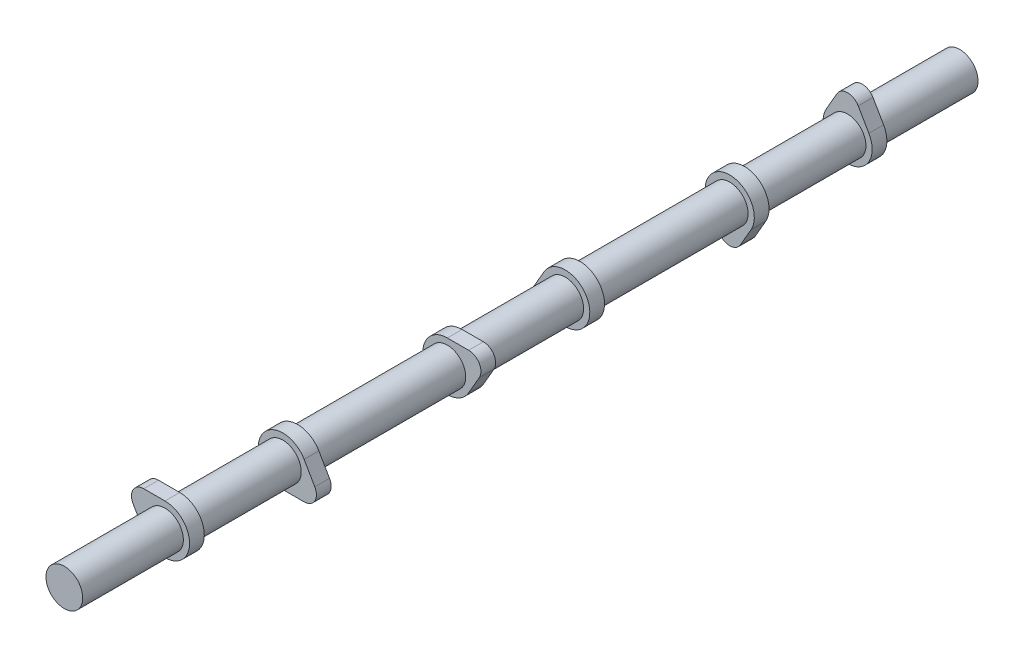
ISO-10303-21;
HEADER;
FILE_DESCRIPTION(('STEP AP214'),'2;1');
FILE_NAME('part.step','',(''),(''),'','','');
FILE_SCHEMA(('AUTOMOTIVE_DESIGN { 1 0 10303 214 1 1 1 1 }'));
ENDSEC;
DATA;
#1=APPLICATION_CONTEXT('core data for automotive mechanical design processes');
#2=APPLICATION_PROTOCOL_DEFINITION('international standard','automotive_design',2000,#1);
#3=PRODUCT_CONTEXT('',#1,'mechanical');
#4=PRODUCT('Part','Part','',(#3));
#5=PRODUCT_RELATED_PRODUCT_CATEGORY('part','',(#4));
#6=PRODUCT_DEFINITION_FORMATION('','',#4);
#7=PRODUCT_DEFINITION_CONTEXT('part definition',#1,'design');
#8=PRODUCT_DEFINITION('design','',#6,#7);
#9=PRODUCT_DEFINITION_SHAPE('','',#8);
#10=(LENGTH_UNIT() NAMED_UNIT(*) SI_UNIT(.MILLI.,.METRE.));
#11=(NAMED_UNIT(*) PLANE_ANGLE_UNIT() SI_UNIT($,.RADIAN.));
#12=(NAMED_UNIT(*) SI_UNIT($,.STERADIAN.) SOLID_ANGLE_UNIT());
#13=UNCERTAINTY_MEASURE_WITH_UNIT(LENGTH_MEASURE(1.E-05),#10,'distance_accuracy_value','');
#14=(GEOMETRIC_REPRESENTATION_CONTEXT(3) GLOBAL_UNCERTAINTY_ASSIGNED_CONTEXT((#13)) GLOBAL_UNIT_ASSIGNED_CONTEXT((#10,
#11,#12)) REPRESENTATION_CONTEXT('',''));
#15=CARTESIAN_POINT('',(0.,0.,0.));
#16=DIRECTION('',(0.,0.,1.));
#17=DIRECTION('',(1.,0.,0.));
#18=AXIS2_PLACEMENT_3D('',#15,#16,#17);
#19=CARTESIAN_POINT('',(-10.9985226280624,6.34999999999997,68.58));
#20=DIRECTION('',(0.,0.,-1.));
#21=DIRECTION('',(-0.499999999999998,-0.86602540378444,0.));
#22=AXIS2_PLACEMENT_3D('',#19,#20,#21);
#23=CYLINDRICAL_SURFACE('',#22,6.35);
#24=CARTESIAN_POINT('',(-10.9985226280624,6.34999999999997,60.96));
#25=DIRECTION('',(0.,0.,1.));
#26=DIRECTION('',(0.499999999999998,0.86602540378444,0.));
#27=AXIS2_PLACEMENT_3D('',#24,#25,#26);
#28=CIRCLE('',#27,6.35);
#29=CARTESIAN_POINT('',(-10.9985226280624,12.7,60.96));
#30=VERTEX_POINT('',#29);
#31=CARTESIAN_POINT('',(-16.4977839420936,3.17499999999996,60.96));
#32=VERTEX_POINT('',#31);
#33=EDGE_CURVE('E456',#30,#32,#28,.T.);
#34=ORIENTED_EDGE('',*,*,#33,.T.);
#35=DIRECTION('',(0.,0.,-1.));
#36=VECTOR('',#35,1.);
#37=CARTESIAN_POINT('',(-16.4977839420936,3.17499999999996,68.58));
#38=LINE('',#37,#36);
#39=CARTESIAN_POINT('',(-16.4977839420936,3.17499999999996,68.58));
#40=VERTEX_POINT('',#39);
#41=EDGE_CURVE('E486',#40,#32,#38,.T.);
#42=ORIENTED_EDGE('',*,*,#41,.F.);
#43=CARTESIAN_POINT('',(-10.9985226280624,6.34999999999997,68.58));
#44=DIRECTION('',(0.,0.,1.));
#45=DIRECTION('',(0.499999999999998,0.86602540378444,0.));
#46=AXIS2_PLACEMENT_3D('',#43,#44,#45);
#47=CIRCLE('',#46,6.35);
#48=CARTESIAN_POINT('',(-10.9985226280624,12.7,68.58));
#49=VERTEX_POINT('',#48);
#50=EDGE_CURVE('E457',#49,#40,#47,.T.);
#51=ORIENTED_EDGE('',*,*,#50,.F.);
#52=DIRECTION('',(0.,0.,-1.));
#53=VECTOR('',#52,1.);
#54=CARTESIAN_POINT('',(-10.9985226280624,12.7,68.58));
#55=LINE('',#54,#53);
#56=EDGE_CURVE('E467',#49,#30,#55,.T.);
#57=ORIENTED_EDGE('',*,*,#56,.T.);
#58=EDGE_LOOP('',(#34,#42,#51,#57));
#59=FACE_BOUND('',#58,.T.);
#60=ADVANCED_FACE('F41',(#59),#23,.T.);
#61=CARTESIAN_POINT('',(-16.4977839420936,3.17499999999996,68.58));
#62=DIRECTION('',(0.866025403784437,0.500000000000002,0.));
#63=DIRECTION('',(-0.500000000000002,0.866025403784437,0.));
#64=AXIS2_PLACEMENT_3D('',#61,#62,#63);
#65=PLANE('',#64);
#66=DIRECTION('',(0.500000000000002,-0.866025403784437,0.));
#67=VECTOR('',#66,1.);
#68=CARTESIAN_POINT('',(-16.4977839420936,3.17499999999996,60.96));
#69=LINE('',#68,#67);
#70=CARTESIAN_POINT('',(-10.9985226280624,-6.35000000000002,60.96));
#71=VERTEX_POINT('',#70);
#72=EDGE_CURVE('E471',#32,#71,#69,.T.);
#73=ORIENTED_EDGE('',*,*,#72,.T.);
#74=DIRECTION('',(0.,0.,-1.));
#75=VECTOR('',#74,1.);
#76=CARTESIAN_POINT('',(-10.9985226280624,-6.35000000000002,68.58));
#77=LINE('',#76,#75);
#78=CARTESIAN_POINT('',(-10.9985226280624,-6.35000000000002,68.58));
#79=VERTEX_POINT('',#78);
#80=EDGE_CURVE('E483',#79,#71,#77,.T.);
#81=ORIENTED_EDGE('',*,*,#80,.F.);
#82=DIRECTION('',(0.500000000000002,-0.866025403784437,0.));
#83=VECTOR('',#82,1.);
#84=CARTESIAN_POINT('',(-16.4977839420936,3.17499999999996,68.58));
#85=LINE('',#84,#83);
#86=EDGE_CURVE('E91',#40,#79,#85,.T.);
#87=ORIENTED_EDGE('',*,*,#86,.F.);
#88=ORIENTED_EDGE('',*,*,#41,.T.);
#89=EDGE_LOOP('',(#73,#81,#87,#88));
#90=FACE_BOUND('',#89,.T.);
#91=ADVANCED_FACE('F507',(#90),#65,.F.);
#92=CARTESIAN_POINT('',(0.,0.,68.58));
#93=DIRECTION('',(0.,0.,-1.));
#94=DIRECTION('',(-0.499999999999998,-0.86602540378444,0.));
#95=AXIS2_PLACEMENT_3D('',#92,#93,#94);
#96=CYLINDRICAL_SURFACE('',#95,12.7);
#97=CARTESIAN_POINT('',(0.,0.,60.96));
#98=DIRECTION('',(0.,0.,1.));
#99=DIRECTION('',(0.499999999999998,0.86602540378444,0.));
#100=AXIS2_PLACEMENT_3D('',#97,#98,#99);
#101=CIRCLE('',#100,12.7);
#102=CARTESIAN_POINT('',(0.,12.7,60.96));
#103=VERTEX_POINT('',#102);
#104=EDGE_CURVE('E77',#71,#103,#101,.T.);
#105=ORIENTED_EDGE('',*,*,#104,.T.);
#106=DIRECTION('',(0.,0.,-1.));
#107=VECTOR('',#106,1.);
#108=CARTESIAN_POINT('',(0.,12.7,68.58));
#109=LINE('',#108,#107);
#110=CARTESIAN_POINT('',(0.,12.7,68.58));
#111=VERTEX_POINT('',#110);
#112=EDGE_CURVE('E480',#111,#103,#109,.T.);
#113=ORIENTED_EDGE('',*,*,#112,.F.);
#114=CARTESIAN_POINT('',(0.,0.,68.58));
#115=DIRECTION('',(0.,0.,1.));
#116=DIRECTION('',(0.499999999999998,0.86602540378444,0.));
#117=AXIS2_PLACEMENT_3D('',#114,#115,#116);
#118=CIRCLE('',#117,12.7);
#119=EDGE_CURVE('E462',#79,#111,#118,.T.);
#120=ORIENTED_EDGE('',*,*,#119,.F.);
#121=ORIENTED_EDGE('',*,*,#80,.T.);
#122=EDGE_LOOP('',(#105,#113,#120,#121));
#123=FACE_BOUND('',#122,.T.);
#124=ADVANCED_FACE('F506',(#123),#96,.T.);
#125=CARTESIAN_POINT('',(-10.9985226280624,12.7,68.58));
#126=DIRECTION('',(0.,-1.,0.));
#127=DIRECTION('',(1.,0.,0.));
#128=AXIS2_PLACEMENT_3D('',#125,#126,#127);
#129=PLANE('',#128);
#130=DIRECTION('',(-1.,0.,0.));
#131=VECTOR('',#130,1.);
#132=CARTESIAN_POINT('',(-10.9985226280624,12.7,60.96));
#133=LINE('',#132,#131);
#134=EDGE_CURVE('E83',#103,#30,#133,.T.);
#135=ORIENTED_EDGE('',*,*,#134,.T.);
#136=ORIENTED_EDGE('',*,*,#56,.F.);
#137=DIRECTION('',(-1.,0.,0.));
#138=VECTOR('',#137,1.);
#139=CARTESIAN_POINT('',(-10.9985226280624,12.7,68.58));
#140=LINE('',#139,#138);
#141=EDGE_CURVE('E59',#111,#49,#140,.T.);
#142=ORIENTED_EDGE('',*,*,#141,.F.);
#143=ORIENTED_EDGE('',*,*,#112,.T.);
#144=EDGE_LOOP('',(#135,#136,#142,#143));
#145=FACE_BOUND('',#144,.T.);
#146=ADVANCED_FACE('F504',(#145),#129,.F.);
#147=CARTESIAN_POINT('',(-10.9985226280624,6.34999999999997,68.58));
#148=DIRECTION('',(0.,0.,1.));
#149=DIRECTION('',(0.499999999999998,0.86602540378444,0.));
#150=AXIS2_PLACEMENT_3D('',#147,#148,#149);
#151=PLANE('',#150);
#152=CARTESIAN_POINT('',(0.,0.,68.58));
#153=DIRECTION('',(0.,0.,1.));
#154=DIRECTION('',(-0.499999999999992,-0.866025403784443,0.));
#155=AXIS2_PLACEMENT_3D('',#152,#153,#154);
#156=CIRCLE('',#155,9.5);
#157=CARTESIAN_POINT('',(-4.74999999999992,-8.22724133595221,68.58));
#158=VERTEX_POINT('',#157);
#159=EDGE_CURVE('E452',#158,#158,#156,.F.);
#160=ORIENTED_EDGE('',*,*,#159,.T.);
#161=EDGE_LOOP('',(#160));
#162=FACE_BOUND('',#161,.T.);
#163=ORIENTED_EDGE('',*,*,#50,.T.);
#164=ORIENTED_EDGE('',*,*,#86,.T.);
#165=ORIENTED_EDGE('',*,*,#119,.T.);
#166=ORIENTED_EDGE('',*,*,#141,.T.);
#167=EDGE_LOOP('',(#163,#164,#165,#166));
#168=FACE_BOUND('',#167,.T.);
#169=ADVANCED_FACE('F498',(#162,#168),#151,.T.);
#170=CARTESIAN_POINT('',(-10.9985226280624,6.34999999999997,60.96));
#171=DIRECTION('',(0.,0.,1.));
#172=DIRECTION('',(0.499999999999998,0.86602540378444,0.));
#173=AXIS2_PLACEMENT_3D('',#170,#171,#172);
#174=PLANE('',#173);
#175=CARTESIAN_POINT('',(0.,0.,60.96));
#176=DIRECTION('',(0.,0.,1.));
#177=DIRECTION('',(-0.499999999999992,-0.866025403784443,0.));
#178=AXIS2_PLACEMENT_3D('',#175,#176,#177);
#179=CIRCLE('',#178,9.5);
#180=CARTESIAN_POINT('',(-4.74999999999992,-8.22724133595221,60.96));
#181=VERTEX_POINT('',#180);
#182=EDGE_CURVE('E51',#181,#181,#179,.F.);
#183=ORIENTED_EDGE('',*,*,#182,.F.);
#184=EDGE_LOOP('',(#183));
#185=FACE_BOUND('',#184,.T.);
#186=ORIENTED_EDGE('',*,*,#33,.F.);
#187=ORIENTED_EDGE('',*,*,#134,.F.);
#188=ORIENTED_EDGE('',*,*,#104,.F.);
#189=ORIENTED_EDGE('',*,*,#72,.F.);
#190=EDGE_LOOP('',(#186,#187,#188,#189));
#191=FACE_BOUND('',#190,.T.);
#192=ADVANCED_FACE('F495',(#185,#191),#174,.F.);
#193=CARTESIAN_POINT('',(0.,0.,120.65));
#194=DIRECTION('',(0.,0.,-1.));
#195=DIRECTION('',(0.499999999999992,0.866025403784443,0.));
#196=AXIS2_PLACEMENT_3D('',#193,#194,#195);
#197=CYLINDRICAL_SURFACE('',#196,9.5);
#198=CARTESIAN_POINT('',(0.,0.,7.62));
#199=DIRECTION('',(0.,0.,1.));
#200=DIRECTION('',(-0.499999999999992,-0.866025403784443,0.));
#201=AXIS2_PLACEMENT_3D('',#198,#199,#200);
#202=CIRCLE('',#201,9.5);
#203=CARTESIAN_POINT('',(-4.74999999999992,-8.22724133595221,7.62));
#204=VERTEX_POINT('',#203);
#205=EDGE_CURVE('E44',#204,#204,#202,.T.);
#206=ORIENTED_EDGE('',*,*,#205,.T.);
#207=EDGE_LOOP('',(#206));
#208=FACE_BOUND('',#207,.T.);
#209=ORIENTED_EDGE('',*,*,#182,.T.);
#210=EDGE_LOOP('',(#209));
#211=FACE_BOUND('',#210,.T.);
#212=ADVANCED_FACE('F493',(#208,#211),#197,.T.);
#213=ORIENTED_EDGE('',*,*,#159,.F.);
#214=EDGE_LOOP('',(#213));
#215=FACE_BOUND('',#214,.T.);
#216=CARTESIAN_POINT('',(0.,0.,120.65));
#217=DIRECTION('',(0.,0.,1.));
#218=DIRECTION('',(-0.499999999999992,-0.866025403784443,0.));
#219=AXIS2_PLACEMENT_3D('',#216,#217,#218);
#220=CIRCLE('',#219,9.5);
#221=CARTESIAN_POINT('',(-4.74999999999992,-8.22724133595221,120.65));
#222=VERTEX_POINT('',#221);
#223=EDGE_CURVE('E448',#222,#222,#220,.T.);
#224=ORIENTED_EDGE('',*,*,#223,.F.);
#225=EDGE_LOOP('',(#224));
#226=FACE_BOUND('',#225,.T.);
#227=ADVANCED_FACE('F520',(#215,#226),#197,.T.);
#228=CARTESIAN_POINT('',(0.,0.,120.65));
#229=DIRECTION('',(0.,0.,1.));
#230=DIRECTION('',(-0.499999999999992,-0.866025403784443,0.));
#231=AXIS2_PLACEMENT_3D('',#228,#229,#230);
#232=PLANE('',#231);
#233=ORIENTED_EDGE('',*,*,#223,.T.);
#234=EDGE_LOOP('',(#233));
#235=FACE_BOUND('',#234,.T.);
#236=ADVANCED_FACE('F523',(#235),#232,.T.);
#237=CARTESIAN_POINT('',(10.9985226280624,-6.3499999999999,7.62));
#238=DIRECTION('',(0.,0.,-1.));
#239=DIRECTION('',(0.499999999999992,0.866025403784443,0.));
#240=AXIS2_PLACEMENT_3D('',#237,#238,#239);
#241=CYLINDRICAL_SURFACE('',#240,6.35);
#242=CARTESIAN_POINT('',(10.9985226280624,-6.3499999999999,0.));
#243=DIRECTION('',(0.,0.,1.));
#244=DIRECTION('',(-0.499999999999992,-0.866025403784443,0.));
#245=AXIS2_PLACEMENT_3D('',#242,#243,#244);
#246=CIRCLE('',#245,6.35);
#247=CARTESIAN_POINT('',(10.9985226280625,-12.6999999999999,0.));
#248=VERTEX_POINT('',#247);
#249=CARTESIAN_POINT('',(16.4977839420936,-3.17499999999985,0.));
#250=VERTEX_POINT('',#249);
#251=EDGE_CURVE('E403',#248,#250,#246,.T.);
#252=ORIENTED_EDGE('',*,*,#251,.T.);
#253=DIRECTION('',(0.,0.,-1.));
#254=VECTOR('',#253,1.);
#255=CARTESIAN_POINT('',(16.4977839420936,-3.17499999999985,7.62));
#256=LINE('',#255,#254);
#257=CARTESIAN_POINT('',(16.4977839420936,-3.17499999999985,7.62));
#258=VERTEX_POINT('',#257);
#259=EDGE_CURVE('E444',#258,#250,#256,.T.);
#260=ORIENTED_EDGE('',*,*,#259,.F.);
#261=CARTESIAN_POINT('',(10.9985226280624,-6.3499999999999,7.62));
#262=DIRECTION('',(0.,0.,1.));
#263=DIRECTION('',(-0.499999999999992,-0.866025403784443,0.));
#264=AXIS2_PLACEMENT_3D('',#261,#262,#263);
#265=CIRCLE('',#264,6.35);
#266=CARTESIAN_POINT('',(10.9985226280625,-12.6999999999999,7.62));
#267=VERTEX_POINT('',#266);
#268=EDGE_CURVE('E407',#267,#258,#265,.T.);
#269=ORIENTED_EDGE('',*,*,#268,.F.);
#270=DIRECTION('',(0.,0.,-1.));
#271=VECTOR('',#270,1.);
#272=CARTESIAN_POINT('',(10.9985226280625,-12.6999999999999,7.62));
#273=LINE('',#272,#271);
#274=EDGE_CURVE('E421',#267,#248,#273,.T.);
#275=ORIENTED_EDGE('',*,*,#274,.T.);
#276=EDGE_LOOP('',(#252,#260,#269,#275));
#277=FACE_BOUND('',#276,.T.);
#278=ADVANCED_FACE('F528',(#277),#241,.T.);
#279=CARTESIAN_POINT('',(16.4977839420936,-3.17499999999985,7.62));
#280=DIRECTION('',(-0.866025403784434,-0.500000000000008,0.));
#281=DIRECTION('',(0.500000000000008,-0.866025403784434,0.));
#282=AXIS2_PLACEMENT_3D('',#279,#280,#281);
#283=PLANE('',#282);
#284=DIRECTION('',(-0.500000000000008,0.866025403784434,0.));
#285=VECTOR('',#284,1.);
#286=CARTESIAN_POINT('',(16.4977839420936,-3.17499999999985,0.));
#287=LINE('',#286,#285);
#288=CARTESIAN_POINT('',(10.9985226280623,6.3500000000001,0.));
#289=VERTEX_POINT('',#288);
#290=EDGE_CURVE('E425',#250,#289,#287,.T.);
#291=ORIENTED_EDGE('',*,*,#290,.T.);
#292=DIRECTION('',(0.,0.,-1.));
#293=VECTOR('',#292,1.);
#294=CARTESIAN_POINT('',(10.9985226280623,6.3500000000001,7.62));
#295=LINE('',#294,#293);
#296=CARTESIAN_POINT('',(10.9985226280623,6.3500000000001,7.62));
#297=VERTEX_POINT('',#296);
#298=EDGE_CURVE('E440',#297,#289,#295,.T.);
#299=ORIENTED_EDGE('',*,*,#298,.F.);
#300=DIRECTION('',(-0.500000000000008,0.866025403784434,0.));
#301=VECTOR('',#300,1.);
#302=CARTESIAN_POINT('',(16.4977839420936,-3.17499999999985,7.62));
#303=LINE('',#302,#301);
#304=EDGE_CURVE('E411',#258,#297,#303,.T.);
#305=ORIENTED_EDGE('',*,*,#304,.F.);
#306=ORIENTED_EDGE('',*,*,#259,.T.);
#307=EDGE_LOOP('',(#291,#299,#305,#306));
#308=FACE_BOUND('',#307,.T.);
#309=ADVANCED_FACE('F532',(#308),#283,.F.);
#310=CARTESIAN_POINT('',(0.,0.,7.62));
#311=DIRECTION('',(0.,0.,-1.));
#312=DIRECTION('',(0.499999999999992,0.866025403784443,0.));
#313=AXIS2_PLACEMENT_3D('',#310,#311,#312);
#314=CYLINDRICAL_SURFACE('',#313,12.7);
#315=CARTESIAN_POINT('',(0.,0.,0.));
#316=DIRECTION('',(0.,0.,1.));
#317=DIRECTION('',(-0.499999999999992,-0.866025403784443,0.));
#318=AXIS2_PLACEMENT_3D('',#315,#316,#317);
#319=CIRCLE('',#318,12.7);
#320=CARTESIAN_POINT('',(1.21430643318376E-13,-12.7,0.));
#321=VERTEX_POINT('',#320);
#322=EDGE_CURVE('E428',#289,#321,#319,.T.);
#323=ORIENTED_EDGE('',*,*,#322,.T.);
#324=DIRECTION('',(0.,0.,-1.));
#325=VECTOR('',#324,1.);
#326=CARTESIAN_POINT('',(1.21430643318376E-13,-12.7,7.62));
#327=LINE('',#326,#325);
#328=CARTESIAN_POINT('',(1.21430643318376E-13,-12.7,7.62));
#329=VERTEX_POINT('',#328);
#330=EDGE_CURVE('E436',#329,#321,#327,.T.);
#331=ORIENTED_EDGE('',*,*,#330,.F.);
#332=CARTESIAN_POINT('',(0.,0.,7.62));
#333=DIRECTION('',(0.,0.,1.));
#334=DIRECTION('',(-0.499999999999992,-0.866025403784443,0.));
#335=AXIS2_PLACEMENT_3D('',#332,#333,#334);
#336=CIRCLE('',#335,12.7);
#337=EDGE_CURVE('E415',#297,#329,#336,.T.);
#338=ORIENTED_EDGE('',*,*,#337,.F.);
#339=ORIENTED_EDGE('',*,*,#298,.T.);
#340=EDGE_LOOP('',(#323,#331,#338,#339));
#341=FACE_BOUND('',#340,.T.);
#342=ADVANCED_FACE('F536',(#341),#314,.T.);
#343=CARTESIAN_POINT('',(10.9985226280625,-12.6999999999999,7.62));
#344=DIRECTION('',(0.,1.,0.));
#345=DIRECTION('',(-1.,0.,0.));
#346=AXIS2_PLACEMENT_3D('',#343,#344,#345);
#347=PLANE('',#346);
#348=DIRECTION('',(1.,0.,0.));
#349=VECTOR('',#348,1.);
#350=CARTESIAN_POINT('',(10.9985226280625,-12.6999999999999,0.));
#351=LINE('',#350,#349);
#352=EDGE_CURVE('E412',#321,#248,#351,.T.);
#353=ORIENTED_EDGE('',*,*,#352,.T.);
#354=ORIENTED_EDGE('',*,*,#274,.F.);
#355=DIRECTION('',(1.,0.,0.));
#356=VECTOR('',#355,1.);
#357=CARTESIAN_POINT('',(10.9985226280625,-12.6999999999999,7.62));
#358=LINE('',#357,#356);
#359=EDGE_CURVE('E418',#329,#267,#358,.T.);
#360=ORIENTED_EDGE('',*,*,#359,.F.);
#361=ORIENTED_EDGE('',*,*,#330,.T.);
#362=EDGE_LOOP('',(#353,#354,#360,#361));
#363=FACE_BOUND('',#362,.T.);
#364=ADVANCED_FACE('F540',(#363),#347,.F.);
#365=CARTESIAN_POINT('',(10.9985226280624,-6.3499999999999,7.62));
#366=DIRECTION('',(0.,0.,1.));
#367=DIRECTION('',(-0.499999999999992,-0.866025403784443,0.));
#368=AXIS2_PLACEMENT_3D('',#365,#366,#367);
#369=PLANE('',#368);
#370=ORIENTED_EDGE('',*,*,#205,.F.);
#371=EDGE_LOOP('',(#370));
#372=FACE_BOUND('',#371,.T.);
#373=ORIENTED_EDGE('',*,*,#268,.T.);
#374=ORIENTED_EDGE('',*,*,#304,.T.);
#375=ORIENTED_EDGE('',*,*,#337,.T.);
#376=ORIENTED_EDGE('',*,*,#359,.T.);
#377=EDGE_LOOP('',(#373,#374,#375,#376));
#378=FACE_BOUND('',#377,.T.);
#379=ADVANCED_FACE('F544',(#372,#378),#369,.T.);
#380=CARTESIAN_POINT('',(10.9985226280624,-6.3499999999999,0.));
#381=DIRECTION('',(0.,0.,1.));
#382=DIRECTION('',(-0.499999999999992,-0.866025403784443,0.));
#383=AXIS2_PLACEMENT_3D('',#380,#381,#382);
#384=PLANE('',#383);
#385=CARTESIAN_POINT('',(0.,0.,0.));
#386=DIRECTION('',(0.,0.,1.));
#387=DIRECTION('',(-0.499999999999992,-0.866025403784443,0.));
#388=AXIS2_PLACEMENT_3D('',#385,#386,#387);
#389=CIRCLE('',#388,9.5);
#390=CARTESIAN_POINT('',(-4.74999999999992,-8.22724133595221,0.));
#391=VERTEX_POINT('',#390);
#392=EDGE_CURVE('E11',#391,#391,#389,.T.);
#393=ORIENTED_EDGE('',*,*,#392,.T.);
#394=EDGE_LOOP('',(#393));
#395=FACE_BOUND('',#394,.T.);
#396=ORIENTED_EDGE('',*,*,#251,.F.);
#397=ORIENTED_EDGE('',*,*,#352,.F.);
#398=ORIENTED_EDGE('',*,*,#322,.F.);
#399=ORIENTED_EDGE('',*,*,#290,.F.);
#400=EDGE_LOOP('',(#396,#397,#398,#399));
#401=FACE_BOUND('',#400,.T.);
#402=ADVANCED_FACE('F546',(#395,#401),#384,.F.);
#403=ORIENTED_EDGE('',*,*,#392,.F.);
#404=EDGE_LOOP('',(#403));
#405=FACE_BOUND('',#404,.T.);
#406=CARTESIAN_POINT('',(0.,0.,-77.47));
#407=DIRECTION('',(0.,0.,1.));
#408=DIRECTION('',(-0.500000000000004,0.866025403784436,0.));
#409=AXIS2_PLACEMENT_3D('',#406,#407,#408);
#410=CIRCLE('',#409,9.5);
#411=CARTESIAN_POINT('',(-4.75000000000004,8.22724133595215,-77.47));
#412=VERTEX_POINT('',#411);
#413=EDGE_CURVE('E349',#412,#412,#410,.F.);
#414=ORIENTED_EDGE('',*,*,#413,.F.);
#415=EDGE_LOOP('',(#414));
#416=FACE_BOUND('',#415,.T.);
#417=ADVANCED_FACE('F525',(#405,#416),#197,.T.);
#418=CARTESIAN_POINT('',(10.9985226280624,6.34999999999997,-77.47));
#419=DIRECTION('',(0.,0.,-1.));
#420=DIRECTION('',(-0.499999999999998,0.86602540378444,0.));
#421=AXIS2_PLACEMENT_3D('',#418,#419,#420);
#422=CYLINDRICAL_SURFACE('',#421,6.35);
#423=CARTESIAN_POINT('',(10.9985226280624,6.34999999999997,-85.09));
#424=DIRECTION('',(0.,0.,1.));
#425=DIRECTION('',(0.499999999999998,-0.86602540378444,0.));
#426=AXIS2_PLACEMENT_3D('',#423,#424,#425);
#427=CIRCLE('',#426,6.35);
#428=CARTESIAN_POINT('',(16.4977839420936,3.17499999999996,-85.09));
#429=VERTEX_POINT('',#428);
#430=CARTESIAN_POINT('',(10.9985226280624,12.7,-85.09));
#431=VERTEX_POINT('',#430);
#432=EDGE_CURVE('E353',#429,#431,#427,.T.);
#433=ORIENTED_EDGE('',*,*,#432,.T.);
#434=DIRECTION('',(0.,0.,-1.));
#435=VECTOR('',#434,1.);
#436=CARTESIAN_POINT('',(10.9985226280624,12.7,-77.47));
#437=LINE('',#436,#435);
#438=CARTESIAN_POINT('',(10.9985226280624,12.7,-77.47));
#439=VERTEX_POINT('',#438);
#440=EDGE_CURVE('E391',#439,#431,#437,.T.);
#441=ORIENTED_EDGE('',*,*,#440,.F.);
#442=CARTESIAN_POINT('',(10.9985226280624,6.34999999999997,-77.47));
#443=DIRECTION('',(0.,0.,1.));
#444=DIRECTION('',(0.499999999999998,-0.86602540378444,0.));
#445=AXIS2_PLACEMENT_3D('',#442,#443,#444);
#446=CIRCLE('',#445,6.35);
#447=CARTESIAN_POINT('',(16.4977839420936,3.17499999999996,-77.47));
#448=VERTEX_POINT('',#447);
#449=EDGE_CURVE('E354',#448,#439,#446,.T.);
#450=ORIENTED_EDGE('',*,*,#449,.F.);
#451=DIRECTION('',(0.,0.,-1.));
#452=VECTOR('',#451,1.);
#453=CARTESIAN_POINT('',(16.4977839420936,3.17499999999996,-77.47));
#454=LINE('',#453,#452);
#455=EDGE_CURVE('E368',#448,#429,#454,.T.);
#456=ORIENTED_EDGE('',*,*,#455,.T.);
#457=EDGE_LOOP('',(#433,#441,#450,#456));
#458=FACE_BOUND('',#457,.T.);
#459=ADVANCED_FACE('F553',(#458),#422,.T.);
#460=CARTESIAN_POINT('',(10.9985226280624,12.7,-77.47));
#461=DIRECTION('',(0.,-1.,0.));
#462=DIRECTION('',(1.,0.,0.));
#463=AXIS2_PLACEMENT_3D('',#460,#461,#462);
#464=PLANE('',#463);
#465=DIRECTION('',(-1.,0.,0.));
#466=VECTOR('',#465,1.);
#467=CARTESIAN_POINT('',(10.9985226280624,12.7,-85.09));
#468=LINE('',#467,#466);
#469=CARTESIAN_POINT('',(0.,12.7,-85.09));
#470=VERTEX_POINT('',#469);
#471=EDGE_CURVE('E372',#431,#470,#468,.T.);
#472=ORIENTED_EDGE('',*,*,#471,.T.);
#473=DIRECTION('',(0.,0.,-1.));
#474=VECTOR('',#473,1.);
#475=CARTESIAN_POINT('',(0.,12.7,-77.47));
#476=LINE('',#475,#474);
#477=CARTESIAN_POINT('',(0.,12.7,-77.47));
#478=VERTEX_POINT('',#477);
#479=EDGE_CURVE('E387',#478,#470,#476,.T.);
#480=ORIENTED_EDGE('',*,*,#479,.F.);
#481=DIRECTION('',(-1.,0.,0.));
#482=VECTOR('',#481,1.);
#483=CARTESIAN_POINT('',(10.9985226280624,12.7,-77.47));
#484=LINE('',#483,#482);
#485=EDGE_CURVE('E358',#439,#478,#484,.T.);
#486=ORIENTED_EDGE('',*,*,#485,.F.);
#487=ORIENTED_EDGE('',*,*,#440,.T.);
#488=EDGE_LOOP('',(#472,#480,#486,#487));
#489=FACE_BOUND('',#488,.T.);
#490=ADVANCED_FACE('F556',(#489),#464,.F.);
#491=CARTESIAN_POINT('',(0.,0.,-77.47));
#492=DIRECTION('',(0.,0.,-1.));
#493=DIRECTION('',(-0.499999999999998,0.86602540378444,0.));
#494=AXIS2_PLACEMENT_3D('',#491,#492,#493);
#495=CYLINDRICAL_SURFACE('',#494,12.7);
#496=CARTESIAN_POINT('',(0.,0.,-85.09));
#497=DIRECTION('',(0.,0.,1.));
#498=DIRECTION('',(0.499999999999998,-0.86602540378444,0.));
#499=AXIS2_PLACEMENT_3D('',#496,#497,#498);
#500=CIRCLE('',#499,12.7);
#501=CARTESIAN_POINT('',(10.9985226280624,-6.35000000000002,-85.09));
#502=VERTEX_POINT('',#501);
#503=EDGE_CURVE('E375',#470,#502,#500,.T.);
#504=ORIENTED_EDGE('',*,*,#503,.T.);
#505=DIRECTION('',(0.,0.,-1.));
#506=VECTOR('',#505,1.);
#507=CARTESIAN_POINT('',(10.9985226280624,-6.35000000000002,-77.47));
#508=LINE('',#507,#506);
#509=CARTESIAN_POINT('',(10.9985226280624,-6.35000000000002,-77.47));
#510=VERTEX_POINT('',#509);
#511=EDGE_CURVE('E383',#510,#502,#508,.T.);
#512=ORIENTED_EDGE('',*,*,#511,.F.);
#513=CARTESIAN_POINT('',(0.,0.,-77.47));
#514=DIRECTION('',(0.,0.,1.));
#515=DIRECTION('',(0.499999999999998,-0.86602540378444,0.));
#516=AXIS2_PLACEMENT_3D('',#513,#514,#515);
#517=CIRCLE('',#516,12.7);
#518=EDGE_CURVE('E362',#478,#510,#517,.T.);
#519=ORIENTED_EDGE('',*,*,#518,.F.);
#520=ORIENTED_EDGE('',*,*,#479,.T.);
#521=EDGE_LOOP('',(#504,#512,#519,#520));
#522=FACE_BOUND('',#521,.T.);
#523=ADVANCED_FACE('F560',(#522),#495,.T.);
#524=CARTESIAN_POINT('',(16.4977839420936,3.17499999999996,-77.47));
#525=DIRECTION('',(-0.866025403784437,0.500000000000002,0.));
#526=DIRECTION('',(-0.500000000000002,-0.866025403784437,0.));
#527=AXIS2_PLACEMENT_3D('',#524,#525,#526);
#528=PLANE('',#527);
#529=DIRECTION('',(0.500000000000002,0.866025403784437,0.));
#530=VECTOR('',#529,1.);
#531=CARTESIAN_POINT('',(16.4977839420936,3.17499999999996,-85.09));
#532=LINE('',#531,#530);
#533=EDGE_CURVE('E359',#502,#429,#532,.T.);
#534=ORIENTED_EDGE('',*,*,#533,.T.);
#535=ORIENTED_EDGE('',*,*,#455,.F.);
#536=DIRECTION('',(0.500000000000002,0.866025403784437,0.));
#537=VECTOR('',#536,1.);
#538=CARTESIAN_POINT('',(16.4977839420936,3.17499999999996,-77.47));
#539=LINE('',#538,#537);
#540=EDGE_CURVE('E365',#510,#448,#539,.T.);
#541=ORIENTED_EDGE('',*,*,#540,.F.);
#542=ORIENTED_EDGE('',*,*,#511,.T.);
#543=EDGE_LOOP('',(#534,#535,#541,#542));
#544=FACE_BOUND('',#543,.T.);
#545=ADVANCED_FACE('F564',(#544),#528,.F.);
#546=CARTESIAN_POINT('',(10.9985226280624,6.34999999999997,-77.47));
#547=DIRECTION('',(0.,0.,1.));
#548=DIRECTION('',(0.499999999999998,-0.86602540378444,0.));
#549=AXIS2_PLACEMENT_3D('',#546,#547,#548);
#550=PLANE('',#549);
#551=ORIENTED_EDGE('',*,*,#413,.T.);
#552=EDGE_LOOP('',(#551));
#553=FACE_BOUND('',#552,.T.);
#554=ORIENTED_EDGE('',*,*,#449,.T.);
#555=ORIENTED_EDGE('',*,*,#485,.T.);
#556=ORIENTED_EDGE('',*,*,#518,.T.);
#557=ORIENTED_EDGE('',*,*,#540,.T.);
#558=EDGE_LOOP('',(#554,#555,#556,#557));
#559=FACE_BOUND('',#558,.T.);
#560=ADVANCED_FACE('F568',(#553,#559),#550,.T.);
#561=CARTESIAN_POINT('',(10.9985226280624,6.34999999999997,-85.09));
#562=DIRECTION('',(0.,0.,1.));
#563=DIRECTION('',(0.499999999999998,-0.86602540378444,0.));
#564=AXIS2_PLACEMENT_3D('',#561,#562,#563);
#565=PLANE('',#564);
#566=CARTESIAN_POINT('',(0.,0.,-85.09));
#567=DIRECTION('',(0.,0.,1.));
#568=DIRECTION('',(-0.500000000000004,0.866025403784436,0.));
#569=AXIS2_PLACEMENT_3D('',#566,#567,#568);
#570=CIRCLE('',#569,9.5);
#571=CARTESIAN_POINT('',(-4.75000000000004,8.22724133595215,-85.09));
#572=VERTEX_POINT('',#571);
#573=EDGE_CURVE('E395',#572,#572,#570,.F.);
#574=ORIENTED_EDGE('',*,*,#573,.F.);
#575=EDGE_LOOP('',(#574));
#576=FACE_BOUND('',#575,.T.);
#577=ORIENTED_EDGE('',*,*,#432,.F.);
#578=ORIENTED_EDGE('',*,*,#533,.F.);
#579=ORIENTED_EDGE('',*,*,#503,.F.);
#580=ORIENTED_EDGE('',*,*,#471,.F.);
#581=EDGE_LOOP('',(#577,#578,#579,#580));
#582=FACE_BOUND('',#581,.T.);
#583=ADVANCED_FACE('F570',(#576,#582),#565,.F.);
#584=CARTESIAN_POINT('',(0.,0.,-25.4));
#585=DIRECTION('',(0.,0.,-1.));
#586=DIRECTION('',(0.500000000000004,-0.866025403784436,0.));
#587=AXIS2_PLACEMENT_3D('',#584,#585,#586);
#588=CYLINDRICAL_SURFACE('',#587,9.5);
#589=CARTESIAN_POINT('',(0.,0.,-138.43));
#590=DIRECTION('',(0.,0.,1.));
#591=DIRECTION('',(-0.500000000000004,0.866025403784436,0.));
#592=AXIS2_PLACEMENT_3D('',#589,#590,#591);
#593=CIRCLE('',#592,9.5);
#594=CARTESIAN_POINT('',(-4.75000000000004,8.22724133595215,-138.43));
#595=VERTEX_POINT('',#594);
#596=EDGE_CURVE('E348',#595,#595,#593,.T.);
#597=ORIENTED_EDGE('',*,*,#596,.T.);
#598=EDGE_LOOP('',(#597));
#599=FACE_BOUND('',#598,.T.);
#600=ORIENTED_EDGE('',*,*,#573,.T.);
#601=EDGE_LOOP('',(#600));
#602=FACE_BOUND('',#601,.T.);
#603=ADVANCED_FACE('F573',(#599,#602),#588,.T.);
#604=CARTESIAN_POINT('',(-10.9985226280623,-6.35000000000005,-138.43));
#605=DIRECTION('',(0.,0.,-1.));
#606=DIRECTION('',(0.500000000000004,-0.866025403784436,0.));
#607=AXIS2_PLACEMENT_3D('',#604,#605,#606);
#608=CYLINDRICAL_SURFACE('',#607,6.35);
#609=CARTESIAN_POINT('',(-10.9985226280623,-6.35000000000005,-146.05));
#610=DIRECTION('',(0.,0.,1.));
#611=DIRECTION('',(-0.500000000000004,0.866025403784436,0.));
#612=AXIS2_PLACEMENT_3D('',#609,#610,#611);
#613=CIRCLE('',#612,6.35);
#614=CARTESIAN_POINT('',(-16.4977839420935,-3.17500000000008,-146.05));
#615=VERTEX_POINT('',#614);
#616=CARTESIAN_POINT('',(-10.9985226280623,-12.7000000000001,-146.05));
#617=VERTEX_POINT('',#616);
#618=EDGE_CURVE('E305',#615,#617,#613,.T.);
#619=ORIENTED_EDGE('',*,*,#618,.T.);
#620=DIRECTION('',(0.,0.,-1.));
#621=VECTOR('',#620,1.);
#622=CARTESIAN_POINT('',(-10.9985226280623,-12.7000000000001,-138.43));
#623=LINE('',#622,#621);
#624=CARTESIAN_POINT('',(-10.9985226280623,-12.7000000000001,-138.43));
#625=VERTEX_POINT('',#624);
#626=EDGE_CURVE('E344',#625,#617,#623,.T.);
#627=ORIENTED_EDGE('',*,*,#626,.F.);
#628=CARTESIAN_POINT('',(-10.9985226280623,-6.35000000000005,-138.43));
#629=DIRECTION('',(0.,0.,1.));
#630=DIRECTION('',(-0.500000000000004,0.866025403784436,0.));
#631=AXIS2_PLACEMENT_3D('',#628,#629,#630);
#632=CIRCLE('',#631,6.35);
#633=CARTESIAN_POINT('',(-16.4977839420935,-3.17500000000008,-138.43));
#634=VERTEX_POINT('',#633);
#635=EDGE_CURVE('E307',#634,#625,#632,.T.);
#636=ORIENTED_EDGE('',*,*,#635,.F.);
#637=DIRECTION('',(0.,0.,-1.));
#638=VECTOR('',#637,1.);
#639=CARTESIAN_POINT('',(-16.4977839420935,-3.17500000000008,-138.43));
#640=LINE('',#639,#638);
#641=EDGE_CURVE('E321',#634,#615,#640,.T.);
#642=ORIENTED_EDGE('',*,*,#641,.T.);
#643=EDGE_LOOP('',(#619,#627,#636,#642));
#644=FACE_BOUND('',#643,.T.);
#645=ADVANCED_FACE('F584',(#644),#608,.T.);
#646=CARTESIAN_POINT('',(-10.9985226280623,-12.7000000000001,-138.43));
#647=DIRECTION('',(0.,1.,0.));
#648=DIRECTION('',(-1.,0.,0.));
#649=AXIS2_PLACEMENT_3D('',#646,#647,#648);
#650=PLANE('',#649);
#651=DIRECTION('',(1.,0.,0.));
#652=VECTOR('',#651,1.);
#653=CARTESIAN_POINT('',(-10.9985226280623,-12.7000000000001,-146.05));
#654=LINE('',#653,#652);
#655=CARTESIAN_POINT('',(0.,-12.7,-146.05));
#656=VERTEX_POINT('',#655);
#657=EDGE_CURVE('E325',#617,#656,#654,.T.);
#658=ORIENTED_EDGE('',*,*,#657,.T.);
#659=DIRECTION('',(0.,0.,-1.));
#660=VECTOR('',#659,1.);
#661=CARTESIAN_POINT('',(0.,-12.7,-138.43));
#662=LINE('',#661,#660);
#663=CARTESIAN_POINT('',(0.,-12.7,-138.43));
#664=VERTEX_POINT('',#663);
#665=EDGE_CURVE('E340',#664,#656,#662,.T.);
#666=ORIENTED_EDGE('',*,*,#665,.F.);
#667=DIRECTION('',(1.,0.,0.));
#668=VECTOR('',#667,1.);
#669=CARTESIAN_POINT('',(-10.9985226280623,-12.7000000000001,-138.43));
#670=LINE('',#669,#668);
#671=EDGE_CURVE('E311',#625,#664,#670,.T.);
#672=ORIENTED_EDGE('',*,*,#671,.F.);
#673=ORIENTED_EDGE('',*,*,#626,.T.);
#674=EDGE_LOOP('',(#658,#666,#672,#673));
#675=FACE_BOUND('',#674,.T.);
#676=ADVANCED_FACE('F587',(#675),#650,.F.);
#677=CARTESIAN_POINT('',(0.,0.,-138.43));
#678=DIRECTION('',(0.,0.,-1.));
#679=DIRECTION('',(0.500000000000004,-0.866025403784436,0.));
#680=AXIS2_PLACEMENT_3D('',#677,#678,#679);
#681=CYLINDRICAL_SURFACE('',#680,12.7);
#682=CARTESIAN_POINT('',(0.,0.,-146.05));
#683=DIRECTION('',(0.,0.,1.));
#684=DIRECTION('',(-0.500000000000004,0.866025403784436,0.));
#685=AXIS2_PLACEMENT_3D('',#682,#683,#684);
#686=CIRCLE('',#685,12.7);
#687=CARTESIAN_POINT('',(-10.9985226280624,6.34999999999995,-146.05));
#688=VERTEX_POINT('',#687);
#689=EDGE_CURVE('E328',#656,#688,#686,.T.);
#690=ORIENTED_EDGE('',*,*,#689,.T.);
#691=DIRECTION('',(0.,0.,-1.));
#692=VECTOR('',#691,1.);
#693=CARTESIAN_POINT('',(-10.9985226280624,6.34999999999995,-138.43));
#694=LINE('',#693,#692);
#695=CARTESIAN_POINT('',(-10.9985226280624,6.34999999999995,-138.43));
#696=VERTEX_POINT('',#695);
#697=EDGE_CURVE('E336',#696,#688,#694,.T.);
#698=ORIENTED_EDGE('',*,*,#697,.F.);
#699=CARTESIAN_POINT('',(0.,0.,-138.43));
#700=DIRECTION('',(0.,0.,1.));
#701=DIRECTION('',(-0.500000000000004,0.866025403784436,0.));
#702=AXIS2_PLACEMENT_3D('',#699,#700,#701);
#703=CIRCLE('',#702,12.7);
#704=EDGE_CURVE('E315',#664,#696,#703,.T.);
#705=ORIENTED_EDGE('',*,*,#704,.F.);
#706=ORIENTED_EDGE('',*,*,#665,.T.);
#707=EDGE_LOOP('',(#690,#698,#705,#706));
#708=FACE_BOUND('',#707,.T.);
#709=ADVANCED_FACE('F591',(#708),#681,.T.);
#710=CARTESIAN_POINT('',(-16.4977839420935,-3.17500000000008,-138.43));
#711=DIRECTION('',(0.866025403784441,-0.499999999999996,0.));
#712=DIRECTION('',(0.499999999999996,0.866025403784441,0.));
#713=AXIS2_PLACEMENT_3D('',#710,#711,#712);
#714=PLANE('',#713);
#715=DIRECTION('',(-0.499999999999996,-0.866025403784441,0.));
#716=VECTOR('',#715,1.);
#717=CARTESIAN_POINT('',(-16.4977839420935,-3.17500000000008,-146.05));
#718=LINE('',#717,#716);
#719=EDGE_CURVE('E312',#688,#615,#718,.T.);
#720=ORIENTED_EDGE('',*,*,#719,.T.);
#721=ORIENTED_EDGE('',*,*,#641,.F.);
#722=DIRECTION('',(-0.499999999999996,-0.866025403784441,0.));
#723=VECTOR('',#722,1.);
#724=CARTESIAN_POINT('',(-16.4977839420935,-3.17500000000008,-138.43));
#725=LINE('',#724,#723);
#726=EDGE_CURVE('E318',#696,#634,#725,.T.);
#727=ORIENTED_EDGE('',*,*,#726,.F.);
#728=ORIENTED_EDGE('',*,*,#697,.T.);
#729=EDGE_LOOP('',(#720,#721,#727,#728));
#730=FACE_BOUND('',#729,.T.);
#731=ADVANCED_FACE('F595',(#730),#714,.F.);
#732=CARTESIAN_POINT('',(-10.9985226280623,-6.35000000000005,-138.43));
#733=DIRECTION('',(0.,0.,1.));
#734=DIRECTION('',(-0.500000000000004,0.866025403784436,0.));
#735=AXIS2_PLACEMENT_3D('',#732,#733,#734);
#736=PLANE('',#735);
#737=ORIENTED_EDGE('',*,*,#596,.F.);
#738=EDGE_LOOP('',(#737));
#739=FACE_BOUND('',#738,.T.);
#740=ORIENTED_EDGE('',*,*,#635,.T.);
#741=ORIENTED_EDGE('',*,*,#671,.T.);
#742=ORIENTED_EDGE('',*,*,#704,.T.);
#743=ORIENTED_EDGE('',*,*,#726,.T.);
#744=EDGE_LOOP('',(#740,#741,#742,#743));
#745=FACE_BOUND('',#744,.T.);
#746=ADVANCED_FACE('F599',(#739,#745),#736,.T.);
#747=CARTESIAN_POINT('',(-10.9985226280623,-6.35000000000005,-146.05));
#748=DIRECTION('',(0.,0.,1.));
#749=DIRECTION('',(-0.500000000000004,0.866025403784436,0.));
#750=AXIS2_PLACEMENT_3D('',#747,#748,#749);
#751=PLANE('',#750);
#752=CARTESIAN_POINT('',(0.,0.,-146.05));
#753=DIRECTION('',(0.,0.,1.));
#754=DIRECTION('',(-0.500000000000004,0.866025403784436,0.));
#755=AXIS2_PLACEMENT_3D('',#752,#753,#754);
#756=CIRCLE('',#755,9.5);
#757=CARTESIAN_POINT('',(-4.75000000000004,8.22724133595215,-146.05));
#758=VERTEX_POINT('',#757);
#759=EDGE_CURVE('E399',#758,#758,#756,.T.);
#760=ORIENTED_EDGE('',*,*,#759,.T.);
#761=EDGE_LOOP('',(#760));
#762=FACE_BOUND('',#761,.T.);
#763=ORIENTED_EDGE('',*,*,#618,.F.);
#764=ORIENTED_EDGE('',*,*,#719,.F.);
#765=ORIENTED_EDGE('',*,*,#689,.F.);
#766=ORIENTED_EDGE('',*,*,#657,.F.);
#767=EDGE_LOOP('',(#763,#764,#765,#766));
#768=FACE_BOUND('',#767,.T.);
#769=ADVANCED_FACE('F582',(#762,#768),#751,.F.);
#770=ORIENTED_EDGE('',*,*,#759,.F.);
#771=EDGE_LOOP('',(#770));
#772=FACE_BOUND('',#771,.T.);
#773=CARTESIAN_POINT('',(0.,0.,-223.52));
#774=DIRECTION('',(0.,0.,1.));
#775=DIRECTION('',(1.,0.,0.));
#776=AXIS2_PLACEMENT_3D('',#773,#774,#775);
#777=CIRCLE('',#776,9.5);
#778=CARTESIAN_POINT('',(9.5,0.,-223.52));
#779=VERTEX_POINT('',#778);
#780=EDGE_CURVE('E247',#779,#779,#777,.F.);
#781=ORIENTED_EDGE('',*,*,#780,.F.);
#782=EDGE_LOOP('',(#781));
#783=FACE_BOUND('',#782,.T.);
#784=ADVANCED_FACE('F578',(#772,#783),#588,.T.);
#785=CARTESIAN_POINT('',(0.,-12.7,-223.52));
#786=DIRECTION('',(0.,0.,-1.));
#787=DIRECTION('',(1.,0.,0.));
#788=AXIS2_PLACEMENT_3D('',#785,#786,#787);
#789=CYLINDRICAL_SURFACE('',#788,6.35);
#790=CARTESIAN_POINT('',(0.,-12.7,-231.14));
#791=DIRECTION('',(0.,0.,1.));
#792=DIRECTION('',(-1.,0.,0.));
#793=AXIS2_PLACEMENT_3D('',#790,#791,#792);
#794=CIRCLE('',#793,6.35);
#795=CARTESIAN_POINT('',(-5.4992613140313,-15.875,-231.14));
#796=VERTEX_POINT('',#795);
#797=CARTESIAN_POINT('',(5.49926131403107,-15.875,-231.14));
#798=VERTEX_POINT('',#797);
#799=EDGE_CURVE('E256',#796,#798,#794,.T.);
#800=ORIENTED_EDGE('',*,*,#799,.T.);
#801=DIRECTION('',(0.,0.,-1.));
#802=VECTOR('',#801,1.);
#803=CARTESIAN_POINT('',(5.49926131403107,-15.875,-223.52));
#804=LINE('',#803,#802);
#805=CARTESIAN_POINT('',(5.49926131403107,-15.875,-223.52));
#806=VERTEX_POINT('',#805);
#807=EDGE_CURVE('E294',#806,#798,#804,.T.);
#808=ORIENTED_EDGE('',*,*,#807,.F.);
#809=CARTESIAN_POINT('',(0.,-12.7,-223.52));
#810=DIRECTION('',(0.,0.,1.));
#811=DIRECTION('',(-1.,0.,0.));
#812=AXIS2_PLACEMENT_3D('',#809,#810,#811);
#813=CIRCLE('',#812,6.35);
#814=CARTESIAN_POINT('',(-5.4992613140313,-15.875,-223.52));
#815=VERTEX_POINT('',#814);
#816=EDGE_CURVE('E257',#815,#806,#813,.T.);
#817=ORIENTED_EDGE('',*,*,#816,.F.);
#818=DIRECTION('',(0.,0.,-1.));
#819=VECTOR('',#818,1.);
#820=CARTESIAN_POINT('',(-5.4992613140313,-15.875,-223.52));
#821=LINE('',#820,#819);
#822=EDGE_CURVE('E271',#815,#796,#821,.T.);
#823=ORIENTED_EDGE('',*,*,#822,.T.);
#824=EDGE_LOOP('',(#800,#808,#817,#823));
#825=FACE_BOUND('',#824,.T.);
#826=ADVANCED_FACE('F581',(#825),#789,.T.);
#827=CARTESIAN_POINT('',(5.49926131403107,-15.875,-223.52));
#828=DIRECTION('',(-0.866025403784435,0.500000000000006,0.));
#829=DIRECTION('',(-0.500000000000006,-0.866025403784435,0.));
#830=AXIS2_PLACEMENT_3D('',#827,#828,#829);
#831=PLANE('',#830);
#832=DIRECTION('',(0.500000000000006,0.866025403784435,0.));
#833=VECTOR('',#832,1.);
#834=CARTESIAN_POINT('',(5.49926131403107,-15.875,-231.14));
#835=LINE('',#834,#833);
#836=CARTESIAN_POINT('',(10.9985226280623,-6.35000000000008,-231.14));
#837=VERTEX_POINT('',#836);
#838=EDGE_CURVE('E275',#798,#837,#835,.T.);
#839=ORIENTED_EDGE('',*,*,#838,.T.);
#840=DIRECTION('',(0.,0.,-1.));
#841=VECTOR('',#840,1.);
#842=CARTESIAN_POINT('',(10.9985226280623,-6.35000000000008,-223.52));
#843=LINE('',#842,#841);
#844=CARTESIAN_POINT('',(10.9985226280623,-6.35000000000008,-223.52));
#845=VERTEX_POINT('',#844);
#846=EDGE_CURVE('E290',#845,#837,#843,.T.);
#847=ORIENTED_EDGE('',*,*,#846,.F.);
#848=DIRECTION('',(0.500000000000006,0.866025403784435,0.));
#849=VECTOR('',#848,1.);
#850=CARTESIAN_POINT('',(5.49926131403107,-15.875,-223.52));
#851=LINE('',#850,#849);
#852=EDGE_CURVE('E261',#806,#845,#851,.T.);
#853=ORIENTED_EDGE('',*,*,#852,.F.);
#854=ORIENTED_EDGE('',*,*,#807,.T.);
#855=EDGE_LOOP('',(#839,#847,#853,#854));
#856=FACE_BOUND('',#855,.T.);
#857=ADVANCED_FACE('F609',(#856),#831,.F.);
#858=CARTESIAN_POINT('',(0.,0.,-223.52));
#859=DIRECTION('',(0.,0.,-1.));
#860=DIRECTION('',(1.,0.,0.));
#861=AXIS2_PLACEMENT_3D('',#858,#859,#860);
#862=CYLINDRICAL_SURFACE('',#861,12.7);
#863=CARTESIAN_POINT('',(0.,0.,-231.14));
#864=DIRECTION('',(0.,0.,1.));
#865=DIRECTION('',(-1.,0.,0.));
#866=AXIS2_PLACEMENT_3D('',#863,#864,#865);
#867=CIRCLE('',#866,12.7);
#868=CARTESIAN_POINT('',(-10.9985226280624,-6.34999999999993,-231.14));
#869=VERTEX_POINT('',#868);
#870=EDGE_CURVE('E278',#837,#869,#867,.T.);
#871=ORIENTED_EDGE('',*,*,#870,.T.);
#872=DIRECTION('',(0.,0.,-1.));
#873=VECTOR('',#872,1.);
#874=CARTESIAN_POINT('',(-10.9985226280624,-6.34999999999993,-223.52));
#875=LINE('',#874,#873);
#876=CARTESIAN_POINT('',(-10.9985226280624,-6.34999999999993,-223.52));
#877=VERTEX_POINT('',#876);
#878=EDGE_CURVE('E286',#877,#869,#875,.T.);
#879=ORIENTED_EDGE('',*,*,#878,.F.);
#880=CARTESIAN_POINT('',(0.,0.,-223.52));
#881=DIRECTION('',(0.,0.,1.));
#882=DIRECTION('',(-1.,0.,0.));
#883=AXIS2_PLACEMENT_3D('',#880,#881,#882);
#884=CIRCLE('',#883,12.7);
#885=EDGE_CURVE('E265',#845,#877,#884,.T.);
#886=ORIENTED_EDGE('',*,*,#885,.F.);
#887=ORIENTED_EDGE('',*,*,#846,.T.);
#888=EDGE_LOOP('',(#871,#879,#886,#887));
#889=FACE_BOUND('',#888,.T.);
#890=ADVANCED_FACE('F613',(#889),#862,.T.);
#891=CARTESIAN_POINT('',(-5.4992613140313,-15.875,-223.52));
#892=DIRECTION('',(0.866025403784442,0.499999999999994,0.));
#893=DIRECTION('',(-0.499999999999994,0.866025403784442,0.));
#894=AXIS2_PLACEMENT_3D('',#891,#892,#893);
#895=PLANE('',#894);
#896=DIRECTION('',(0.499999999999994,-0.866025403784442,0.));
#897=VECTOR('',#896,1.);
#898=CARTESIAN_POINT('',(-5.4992613140313,-15.875,-231.14));
#899=LINE('',#898,#897);
#900=EDGE_CURVE('E262',#869,#796,#899,.T.);
#901=ORIENTED_EDGE('',*,*,#900,.T.);
#902=ORIENTED_EDGE('',*,*,#822,.F.);
#903=DIRECTION('',(0.499999999999994,-0.866025403784442,0.));
#904=VECTOR('',#903,1.);
#905=CARTESIAN_POINT('',(-5.4992613140313,-15.875,-223.52));
#906=LINE('',#905,#904);
#907=EDGE_CURVE('E268',#877,#815,#906,.T.);
#908=ORIENTED_EDGE('',*,*,#907,.F.);
#909=ORIENTED_EDGE('',*,*,#878,.T.);
#910=EDGE_LOOP('',(#901,#902,#908,#909));
#911=FACE_BOUND('',#910,.T.);
#912=ADVANCED_FACE('F617',(#911),#895,.F.);
#913=CARTESIAN_POINT('',(0.,-12.7,-223.52));
#914=DIRECTION('',(0.,0.,1.));
#915=DIRECTION('',(-1.,0.,0.));
#916=AXIS2_PLACEMENT_3D('',#913,#914,#915);
#917=PLANE('',#916);
#918=ORIENTED_EDGE('',*,*,#780,.T.);
#919=EDGE_LOOP('',(#918));
#920=FACE_BOUND('',#919,.T.);
#921=ORIENTED_EDGE('',*,*,#816,.T.);
#922=ORIENTED_EDGE('',*,*,#852,.T.);
#923=ORIENTED_EDGE('',*,*,#885,.T.);
#924=ORIENTED_EDGE('',*,*,#907,.T.);
#925=EDGE_LOOP('',(#921,#922,#923,#924));
#926=FACE_BOUND('',#925,.T.);
#927=ADVANCED_FACE('F621',(#920,#926),#917,.T.);
#928=CARTESIAN_POINT('',(0.,-12.7,-231.14));
#929=DIRECTION('',(0.,0.,1.));
#930=DIRECTION('',(-1.,0.,0.));
#931=AXIS2_PLACEMENT_3D('',#928,#929,#930);
#932=PLANE('',#931);
#933=CARTESIAN_POINT('',(0.,0.,-231.14));
#934=DIRECTION('',(0.,0.,1.));
#935=DIRECTION('',(1.,0.,0.));
#936=AXIS2_PLACEMENT_3D('',#933,#934,#935);
#937=CIRCLE('',#936,9.5);
#938=CARTESIAN_POINT('',(9.5,0.,-231.14));
#939=VERTEX_POINT('',#938);
#940=EDGE_CURVE('E298',#939,#939,#937,.F.);
#941=ORIENTED_EDGE('',*,*,#940,.F.);
#942=EDGE_LOOP('',(#941));
#943=FACE_BOUND('',#942,.T.);
#944=ORIENTED_EDGE('',*,*,#799,.F.);
#945=ORIENTED_EDGE('',*,*,#900,.F.);
#946=ORIENTED_EDGE('',*,*,#870,.F.);
#947=ORIENTED_EDGE('',*,*,#838,.F.);
#948=EDGE_LOOP('',(#944,#945,#946,#947));
#949=FACE_BOUND('',#948,.T.);
#950=ADVANCED_FACE('F623',(#943,#949),#932,.F.);
#951=CARTESIAN_POINT('',(0.,0.,-171.45));
#952=DIRECTION('',(0.,0.,-1.));
#953=DIRECTION('',(-1.,0.,0.));
#954=AXIS2_PLACEMENT_3D('',#951,#952,#953);
#955=CYLINDRICAL_SURFACE('',#954,9.5);
#956=CARTESIAN_POINT('',(0.,0.,-284.48));
#957=DIRECTION('',(0.,0.,1.));
#958=DIRECTION('',(1.,0.,0.));
#959=AXIS2_PLACEMENT_3D('',#956,#957,#958);
#960=CIRCLE('',#959,9.5);
#961=CARTESIAN_POINT('',(9.5,0.,-284.48));
#962=VERTEX_POINT('',#961);
#963=EDGE_CURVE('E242',#962,#962,#960,.T.);
#964=ORIENTED_EDGE('',*,*,#963,.T.);
#965=EDGE_LOOP('',(#964));
#966=FACE_BOUND('',#965,.T.);
#967=ORIENTED_EDGE('',*,*,#940,.T.);
#968=EDGE_LOOP('',(#967));
#969=FACE_BOUND('',#968,.T.);
#970=ADVANCED_FACE('F626',(#966,#969),#955,.T.);
#971=CARTESIAN_POINT('',(0.,12.7,-284.48));
#972=DIRECTION('',(0.,0.,-1.));
#973=DIRECTION('',(-1.,0.,0.));
#974=AXIS2_PLACEMENT_3D('',#971,#972,#973);
#975=CYLINDRICAL_SURFACE('',#974,6.35);
#976=CARTESIAN_POINT('',(0.,12.7,-292.1));
#977=DIRECTION('',(0.,0.,1.));
#978=DIRECTION('',(1.,0.,0.));
#979=AXIS2_PLACEMENT_3D('',#976,#977,#978);
#980=CIRCLE('',#979,6.35);
#981=CARTESIAN_POINT('',(5.49926131403118,15.875,-292.1));
#982=VERTEX_POINT('',#981);
#983=CARTESIAN_POINT('',(-5.49926131403118,15.875,-292.1));
#984=VERTEX_POINT('',#983);
#985=EDGE_CURVE('E240',#982,#984,#980,.T.);
#986=ORIENTED_EDGE('',*,*,#985,.T.);
#987=DIRECTION('',(0.,0.,-1.));
#988=VECTOR('',#987,1.);
#989=CARTESIAN_POINT('',(-5.49926131403118,15.875,-284.48));
#990=LINE('',#989,#988);
#991=CARTESIAN_POINT('',(-5.49926131403118,15.875,-284.48));
#992=VERTEX_POINT('',#991);
#993=EDGE_CURVE('E218',#992,#984,#990,.T.);
#994=ORIENTED_EDGE('',*,*,#993,.F.);
#995=CARTESIAN_POINT('',(0.,12.7,-284.48));
#996=DIRECTION('',(0.,0.,1.));
#997=DIRECTION('',(1.,0.,0.));
#998=AXIS2_PLACEMENT_3D('',#995,#996,#997);
#999=CIRCLE('',#998,6.35);
#1000=CARTESIAN_POINT('',(5.49926131403118,15.875,-284.48));
#1001=VERTEX_POINT('',#1000);
#1002=EDGE_CURVE('E226',#1001,#992,#999,.T.);
#1003=ORIENTED_EDGE('',*,*,#1002,.F.);
#1004=DIRECTION('',(0.,0.,-1.));
#1005=VECTOR('',#1004,1.);
#1006=CARTESIAN_POINT('',(5.49926131403118,15.875,-284.48));
#1007=LINE('',#1006,#1005);
#1008=EDGE_CURVE('E672',#1001,#982,#1007,.T.);
#1009=ORIENTED_EDGE('',*,*,#1008,.T.);
#1010=EDGE_LOOP('',(#986,#994,#1003,#1009));
#1011=FACE_BOUND('',#1010,.T.);
#1012=ADVANCED_FACE('F238',(#1011),#975,.T.);
#1013=CARTESIAN_POINT('',(-5.49926131403118,15.875,-284.48));
#1014=DIRECTION('',(0.866025403784439,-0.5,0.));
#1015=DIRECTION('',(0.5,0.866025403784439,0.));
#1016=AXIS2_PLACEMENT_3D('',#1013,#1014,#1015);
#1017=PLANE('',#1016);
#1018=DIRECTION('',(-0.5,-0.866025403784439,0.));
#1019=VECTOR('',#1018,1.);
#1020=CARTESIAN_POINT('',(-5.49926131403118,15.875,-292.1));
#1021=LINE('',#1020,#1019);
#1022=CARTESIAN_POINT('',(-10.9985226280624,6.35,-292.1));
#1023=VERTEX_POINT('',#1022);
#1024=EDGE_CURVE('E666',#984,#1023,#1021,.T.);
#1025=ORIENTED_EDGE('',*,*,#1024,.T.);
#1026=DIRECTION('',(0.,0.,-1.));
#1027=VECTOR('',#1026,1.);
#1028=CARTESIAN_POINT('',(-10.9985226280624,6.35,-284.48));
#1029=LINE('',#1028,#1027);
#1030=CARTESIAN_POINT('',(-10.9985226280624,6.35,-284.48));
#1031=VERTEX_POINT('',#1030);
#1032=EDGE_CURVE('E221',#1031,#1023,#1029,.T.);
#1033=ORIENTED_EDGE('',*,*,#1032,.F.);
#1034=DIRECTION('',(-0.5,-0.866025403784439,0.));
#1035=VECTOR('',#1034,1.);
#1036=CARTESIAN_POINT('',(-5.49926131403118,15.875,-284.48));
#1037=LINE('',#1036,#1035);
#1038=EDGE_CURVE('E214',#992,#1031,#1037,.T.);
#1039=ORIENTED_EDGE('',*,*,#1038,.F.);
#1040=ORIENTED_EDGE('',*,*,#993,.T.);
#1041=EDGE_LOOP('',(#1025,#1033,#1039,#1040));
#1042=FACE_BOUND('',#1041,.T.);
#1043=ADVANCED_FACE('F216',(#1042),#1017,.F.);
#1044=CARTESIAN_POINT('',(0.,0.,-284.48));
#1045=DIRECTION('',(0.,0.,-1.));
#1046=DIRECTION('',(-1.,0.,0.));
#1047=AXIS2_PLACEMENT_3D('',#1044,#1045,#1046);
#1048=CYLINDRICAL_SURFACE('',#1047,12.7);
#1049=CARTESIAN_POINT('',(0.,0.,-292.1));
#1050=DIRECTION('',(0.,0.,1.));
#1051=DIRECTION('',(1.,0.,0.));
#1052=AXIS2_PLACEMENT_3D('',#1049,#1050,#1051);
#1053=CIRCLE('',#1052,12.7);
#1054=CARTESIAN_POINT('',(10.9985226280624,6.35,-292.1));
#1055=VERTEX_POINT('',#1054);
#1056=EDGE_CURVE('E676',#1023,#1055,#1053,.T.);
#1057=ORIENTED_EDGE('',*,*,#1056,.T.);
#1058=DIRECTION('',(0.,0.,-1.));
#1059=VECTOR('',#1058,1.);
#1060=CARTESIAN_POINT('',(10.9985226280624,6.35,-284.48));
#1061=LINE('',#1060,#1059);
#1062=CARTESIAN_POINT('',(10.9985226280624,6.35,-284.48));
#1063=VERTEX_POINT('',#1062);
#1064=EDGE_CURVE('E249',#1063,#1055,#1061,.T.);
#1065=ORIENTED_EDGE('',*,*,#1064,.F.);
#1066=CARTESIAN_POINT('',(0.,0.,-284.48));
#1067=DIRECTION('',(0.,0.,1.));
#1068=DIRECTION('',(1.,0.,0.));
#1069=AXIS2_PLACEMENT_3D('',#1066,#1067,#1068);
#1070=CIRCLE('',#1069,12.7);
#1071=EDGE_CURVE('E225',#1031,#1063,#1070,.T.);
#1072=ORIENTED_EDGE('',*,*,#1071,.F.);
#1073=ORIENTED_EDGE('',*,*,#1032,.T.);
#1074=EDGE_LOOP('',(#1057,#1065,#1072,#1073));
#1075=FACE_BOUND('',#1074,.T.);
#1076=ADVANCED_FACE('F641',(#1075),#1048,.T.);
#1077=CARTESIAN_POINT('',(5.49926131403118,15.875,-284.48));
#1078=DIRECTION('',(-0.866025403784439,-0.5,0.));
#1079=DIRECTION('',(0.5,-0.866025403784439,0.));
#1080=AXIS2_PLACEMENT_3D('',#1077,#1078,#1079);
#1081=PLANE('',#1080);
#1082=DIRECTION('',(-0.5,0.866025403784439,0.));
#1083=VECTOR('',#1082,1.);
#1084=CARTESIAN_POINT('',(5.49926131403118,15.875,-292.1));
#1085=LINE('',#1084,#1083);
#1086=EDGE_CURVE('E236',#1055,#982,#1085,.T.);
#1087=ORIENTED_EDGE('',*,*,#1086,.T.);
#1088=ORIENTED_EDGE('',*,*,#1008,.F.);
#1089=DIRECTION('',(-0.5,0.866025403784439,0.));
#1090=VECTOR('',#1089,1.);
#1091=CARTESIAN_POINT('',(5.49926131403118,15.875,-284.48));
#1092=LINE('',#1091,#1090);
#1093=EDGE_CURVE('E231',#1063,#1001,#1092,.T.);
#1094=ORIENTED_EDGE('',*,*,#1093,.F.);
#1095=ORIENTED_EDGE('',*,*,#1064,.T.);
#1096=EDGE_LOOP('',(#1087,#1088,#1094,#1095));
#1097=FACE_BOUND('',#1096,.T.);
#1098=ADVANCED_FACE('F644',(#1097),#1081,.F.);
#1099=CARTESIAN_POINT('',(0.,12.7,-284.48));
#1100=DIRECTION('',(0.,0.,1.));
#1101=DIRECTION('',(1.,0.,0.));
#1102=AXIS2_PLACEMENT_3D('',#1099,#1100,#1101);
#1103=PLANE('',#1102);
#1104=ORIENTED_EDGE('',*,*,#963,.F.);
#1105=EDGE_LOOP('',(#1104));
#1106=FACE_BOUND('',#1105,.T.);
#1107=ORIENTED_EDGE('',*,*,#1002,.T.);
#1108=ORIENTED_EDGE('',*,*,#1038,.T.);
#1109=ORIENTED_EDGE('',*,*,#1071,.T.);
#1110=ORIENTED_EDGE('',*,*,#1093,.T.);
#1111=EDGE_LOOP('',(#1107,#1108,#1109,#1110));
#1112=FACE_BOUND('',#1111,.T.);
#1113=ADVANCED_FACE('F229',(#1106,#1112),#1103,.T.);
#1114=CARTESIAN_POINT('',(0.,12.7,-292.1));
#1115=DIRECTION('',(0.,0.,1.));
#1116=DIRECTION('',(1.,0.,0.));
#1117=AXIS2_PLACEMENT_3D('',#1114,#1115,#1116);
#1118=PLANE('',#1117);
#1119=CARTESIAN_POINT('',(0.,0.,-292.1));
#1120=DIRECTION('',(0.,0.,1.));
#1121=DIRECTION('',(1.,0.,0.));
#1122=AXIS2_PLACEMENT_3D('',#1119,#1120,#1121);
#1123=CIRCLE('',#1122,9.5);
#1124=CARTESIAN_POINT('',(9.5,0.,-292.1));
#1125=VERTEX_POINT('',#1124);
#1126=EDGE_CURVE('E302',#1125,#1125,#1123,.T.);
#1127=ORIENTED_EDGE('',*,*,#1126,.T.);
#1128=EDGE_LOOP('',(#1127));
#1129=FACE_BOUND('',#1128,.T.);
#1130=ORIENTED_EDGE('',*,*,#985,.F.);
#1131=ORIENTED_EDGE('',*,*,#1086,.F.);
#1132=ORIENTED_EDGE('',*,*,#1056,.F.);
#1133=ORIENTED_EDGE('',*,*,#1024,.F.);
#1134=EDGE_LOOP('',(#1130,#1131,#1132,#1133));
#1135=FACE_BOUND('',#1134,.T.);
#1136=ADVANCED_FACE('F635',(#1129,#1135),#1118,.F.);
#1137=ORIENTED_EDGE('',*,*,#1126,.F.);
#1138=EDGE_LOOP('',(#1137));
#1139=FACE_BOUND('',#1138,.T.);
#1140=CARTESIAN_POINT('',(0.,0.,-342.44));
#1141=DIRECTION('',(0.,0.,-1.));
#1142=DIRECTION('',(-1.,0.,0.));
#1143=AXIS2_PLACEMENT_3D('',#1140,#1141,#1142);
#1144=CIRCLE('',#1143,9.5);
#1145=CARTESIAN_POINT('',(-9.5,0.,-342.44));
#1146=VERTEX_POINT('',#1145);
#1147=EDGE_CURVE('E661',#1146,#1146,#1144,.T.);
#1148=ORIENTED_EDGE('',*,*,#1147,.F.);
#1149=EDGE_LOOP('',(#1148));
#1150=FACE_BOUND('',#1149,.T.);
#1151=ADVANCED_FACE('F631',(#1139,#1150),#955,.T.);
#1152=CARTESIAN_POINT('',(0.,0.,-342.44));
#1153=DIRECTION('',(0.,0.,-1.));
#1154=DIRECTION('',(-1.,0.,0.));
#1155=AXIS2_PLACEMENT_3D('',#1152,#1153,#1154);
#1156=PLANE('',#1155);
#1157=ORIENTED_EDGE('',*,*,#1147,.T.);
#1158=EDGE_LOOP('',(#1157));
#1159=FACE_BOUND('',#1158,.T.);
#1160=ADVANCED_FACE('F634',(#1159),#1156,.T.);
#1161=CLOSED_SHELL('',(#60,#91,#124,#146,#169,#192,#212,#227,#236,#278,#309,#342,#364,#379,#402,
#417,#459,#490,#523,#545,#560,#583,#603,#645,#676,#709,#731,#746,#769,#784,#826,#857,#890,#912,
#927,#950,#970,#1012,#1043,#1076,#1098,#1113,#1136,#1151,#1160));
#1162=MANIFOLD_SOLID_BREP('B2',#1161);
#1163=ADVANCED_BREP_SHAPE_REPRESENTATION('',(#18,#1162),#14);
#1164=SHAPE_DEFINITION_REPRESENTATION(#9,#1163);
ENDSEC;
END-ISO-10303-21;
